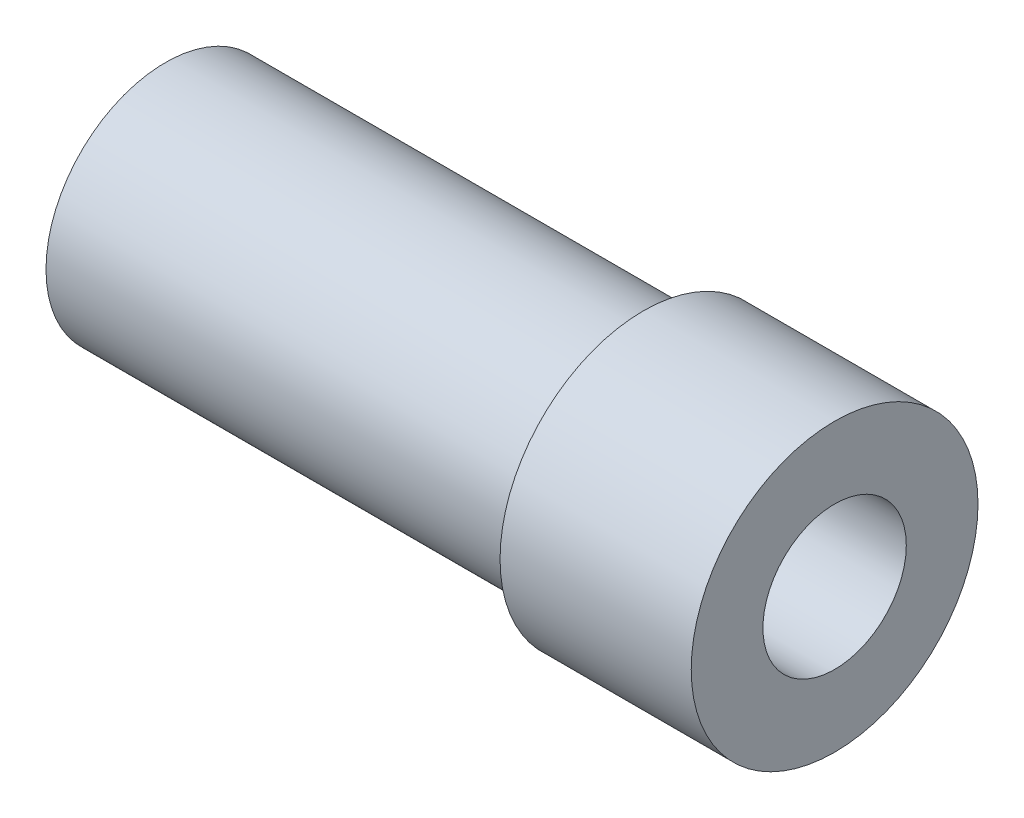
ISO-10303-21;
HEADER;
FILE_DESCRIPTION(('STEP AP214'),'2;1');
FILE_NAME('part.step','',(''),(''),'','','');
FILE_SCHEMA(('AUTOMOTIVE_DESIGN { 1 0 10303 214 1 1 1 1 }'));
ENDSEC;
DATA;
#1=APPLICATION_CONTEXT('core data for automotive mechanical design processes');
#2=APPLICATION_PROTOCOL_DEFINITION('international standard','automotive_design',2000,#1);
#3=PRODUCT_CONTEXT('',#1,'mechanical');
#4=PRODUCT('Part','Part','',(#3));
#5=PRODUCT_RELATED_PRODUCT_CATEGORY('part','',(#4));
#6=PRODUCT_DEFINITION_FORMATION('','',#4);
#7=PRODUCT_DEFINITION_CONTEXT('part definition',#1,'design');
#8=PRODUCT_DEFINITION('design','',#6,#7);
#9=PRODUCT_DEFINITION_SHAPE('','',#8);
#10=(LENGTH_UNIT() NAMED_UNIT(*) SI_UNIT(.MILLI.,.METRE.));
#11=(NAMED_UNIT(*) PLANE_ANGLE_UNIT() SI_UNIT($,.RADIAN.));
#12=(NAMED_UNIT(*) SI_UNIT($,.STERADIAN.) SOLID_ANGLE_UNIT());
#13=UNCERTAINTY_MEASURE_WITH_UNIT(LENGTH_MEASURE(1.E-05),#10,'distance_accuracy_value','');
#14=(GEOMETRIC_REPRESENTATION_CONTEXT(3) GLOBAL_UNCERTAINTY_ASSIGNED_CONTEXT((#13)) GLOBAL_UNIT_ASSIGNED_CONTEXT((#10,
#11,#12)) REPRESENTATION_CONTEXT('',''));
#15=CARTESIAN_POINT('',(0.,0.,0.));
#16=DIRECTION('',(0.,0.,1.));
#17=DIRECTION('',(1.,0.,0.));
#18=AXIS2_PLACEMENT_3D('',#15,#16,#17);
#19=CARTESIAN_POINT('',(44.45,0.,0.));
#20=DIRECTION('',(-1.,0.,0.));
#21=DIRECTION('',(0.,0.,1.));
#22=AXIS2_PLACEMENT_3D('',#19,#20,#21);
#23=CYLINDRICAL_SURFACE('',#22,7.9375);
#24=CARTESIAN_POINT('',(0.,0.,0.));
#25=DIRECTION('',(1.,0.,0.));
#26=DIRECTION('',(0.,0.,-1.));
#27=AXIS2_PLACEMENT_3D('',#24,#25,#26);
#28=CIRCLE('',#27,7.9375);
#29=CARTESIAN_POINT('',(0.,0.,-7.9375));
#30=VERTEX_POINT('',#29);
#31=EDGE_CURVE('E50',#30,#30,#28,.T.);
#32=ORIENTED_EDGE('',*,*,#31,.T.);
#33=EDGE_LOOP('',(#32));
#34=FACE_BOUND('',#33,.T.);
#35=CARTESIAN_POINT('',(31.75,0.,0.));
#36=DIRECTION('',(1.,0.,0.));
#37=DIRECTION('',(0.,0.,-1.));
#38=AXIS2_PLACEMENT_3D('',#35,#36,#37);
#39=CIRCLE('',#38,7.9375);
#40=CARTESIAN_POINT('',(31.75,0.,-7.9375));
#41=VERTEX_POINT('',#40);
#42=EDGE_CURVE('E10',#41,#41,#39,.T.);
#43=ORIENTED_EDGE('',*,*,#42,.F.);
#44=EDGE_LOOP('',(#43));
#45=FACE_BOUND('',#44,.T.);
#46=ADVANCED_FACE('F43',(#34,#45),#23,.T.);
#47=CARTESIAN_POINT('',(44.45,0.,0.));
#48=DIRECTION('',(1.,0.,0.));
#49=DIRECTION('',(0.,0.,-1.));
#50=AXIS2_PLACEMENT_3D('',#47,#48,#49);
#51=PLANE('',#50);
#52=CARTESIAN_POINT('',(44.45,0.,0.));
#53=DIRECTION('',(1.,0.,0.));
#54=DIRECTION('',(0.,0.,-1.));
#55=AXIS2_PLACEMENT_3D('',#52,#53,#54);
#56=CIRCLE('',#55,4.7625);
#57=CARTESIAN_POINT('',(44.45,0.,-4.7625));
#58=VERTEX_POINT('',#57);
#59=EDGE_CURVE('E55',#58,#58,#56,.T.);
#60=ORIENTED_EDGE('',*,*,#59,.F.);
#61=EDGE_LOOP('',(#60));
#62=FACE_BOUND('',#61,.T.);
#63=CARTESIAN_POINT('',(44.45,0.,0.));
#64=DIRECTION('',(1.,0.,0.));
#65=DIRECTION('',(0.,0.,-1.));
#66=AXIS2_PLACEMENT_3D('',#63,#64,#65);
#67=CIRCLE('',#66,9.525);
#68=CARTESIAN_POINT('',(44.45,0.,-9.525));
#69=VERTEX_POINT('',#68);
#70=EDGE_CURVE('E67',#69,#69,#67,.T.);
#71=ORIENTED_EDGE('',*,*,#70,.T.);
#72=EDGE_LOOP('',(#71));
#73=FACE_BOUND('',#72,.T.);
#74=ADVANCED_FACE('F87',(#62,#73),#51,.T.);
#75=CARTESIAN_POINT('',(0.,0.,0.));
#76=DIRECTION('',(1.,0.,0.));
#77=DIRECTION('',(0.,0.,-1.));
#78=AXIS2_PLACEMENT_3D('',#75,#76,#77);
#79=PLANE('',#78);
#80=ORIENTED_EDGE('',*,*,#31,.F.);
#81=EDGE_LOOP('',(#80));
#82=FACE_BOUND('',#81,.T.);
#83=CARTESIAN_POINT('',(0.,0.,0.));
#84=DIRECTION('',(1.,0.,0.));
#85=DIRECTION('',(0.,0.,-1.));
#86=AXIS2_PLACEMENT_3D('',#83,#84,#85);
#87=CIRCLE('',#86,4.7625);
#88=CARTESIAN_POINT('',(0.,0.,-4.7625));
#89=VERTEX_POINT('',#88);
#90=EDGE_CURVE('E60',#89,#89,#87,.T.);
#91=ORIENTED_EDGE('',*,*,#90,.T.);
#92=EDGE_LOOP('',(#91));
#93=FACE_BOUND('',#92,.T.);
#94=ADVANCED_FACE('F92',(#82,#93),#79,.F.);
#95=CARTESIAN_POINT('',(44.45,0.,0.));
#96=DIRECTION('',(-1.,0.,0.));
#97=DIRECTION('',(0.,0.,1.));
#98=AXIS2_PLACEMENT_3D('',#95,#96,#97);
#99=CYLINDRICAL_SURFACE('',#98,4.7625);
#100=ORIENTED_EDGE('',*,*,#59,.T.);
#101=EDGE_LOOP('',(#100));
#102=FACE_BOUND('',#101,.T.);
#103=ORIENTED_EDGE('',*,*,#90,.F.);
#104=EDGE_LOOP('',(#103));
#105=FACE_BOUND('',#104,.T.);
#106=ADVANCED_FACE('F84',(#102,#105),#99,.F.);
#107=CARTESIAN_POINT('',(31.75,0.,0.));
#108=DIRECTION('',(1.,0.,0.));
#109=DIRECTION('',(0.,0.,-1.));
#110=AXIS2_PLACEMENT_3D('',#107,#108,#109);
#111=CYLINDRICAL_SURFACE('',#110,9.525);
#112=CARTESIAN_POINT('',(31.75,0.,0.));
#113=DIRECTION('',(1.,0.,0.));
#114=DIRECTION('',(0.,0.,-1.));
#115=AXIS2_PLACEMENT_3D('',#112,#113,#114);
#116=CIRCLE('',#115,9.525);
#117=CARTESIAN_POINT('',(31.75,0.,-9.525));
#118=VERTEX_POINT('',#117);
#119=EDGE_CURVE('E65',#118,#118,#116,.T.);
#120=ORIENTED_EDGE('',*,*,#119,.T.);
#121=EDGE_LOOP('',(#120));
#122=FACE_BOUND('',#121,.T.);
#123=ORIENTED_EDGE('',*,*,#70,.F.);
#124=EDGE_LOOP('',(#123));
#125=FACE_BOUND('',#124,.T.);
#126=ADVANCED_FACE('F75',(#122,#125),#111,.T.);
#127=CARTESIAN_POINT('',(31.75,0.,0.));
#128=DIRECTION('',(1.,0.,0.));
#129=DIRECTION('',(0.,0.,-1.));
#130=AXIS2_PLACEMENT_3D('',#127,#128,#129);
#131=PLANE('',#130);
#132=ORIENTED_EDGE('',*,*,#42,.T.);
#133=EDGE_LOOP('',(#132));
#134=FACE_BOUND('',#133,.T.);
#135=ORIENTED_EDGE('',*,*,#119,.F.);
#136=EDGE_LOOP('',(#135));
#137=FACE_BOUND('',#136,.T.);
#138=ADVANCED_FACE('F78',(#134,#137),#131,.F.);
#139=CLOSED_SHELL('',(#46,#74,#94,#106,#126,#138));
#140=MANIFOLD_SOLID_BREP('B2',#139);
#141=ADVANCED_BREP_SHAPE_REPRESENTATION('',(#18,#140),#14);
#142=SHAPE_DEFINITION_REPRESENTATION(#9,#141);
ENDSEC;
END-ISO-10303-21;
